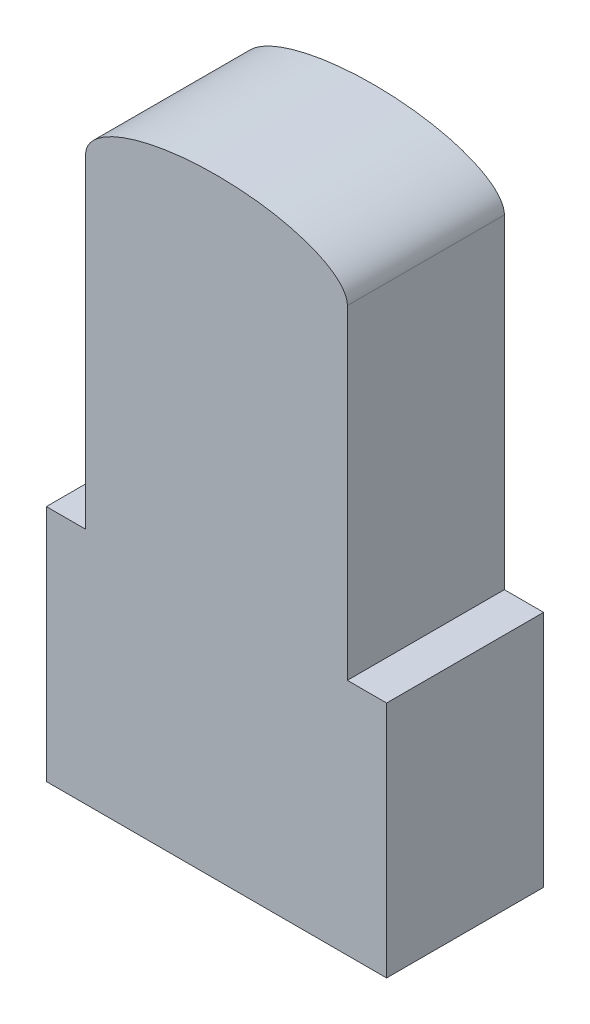
ISO-10303-21;
HEADER;
FILE_DESCRIPTION(('STEP AP214'),'2;1');
FILE_NAME('part.step','',(''),(''),'','','');
FILE_SCHEMA(('AUTOMOTIVE_DESIGN { 1 0 10303 214 1 1 1 1 }'));
ENDSEC;
DATA;
#1=APPLICATION_CONTEXT('core data for automotive mechanical design processes');
#2=APPLICATION_PROTOCOL_DEFINITION('international standard','automotive_design',2000,#1);
#3=PRODUCT_CONTEXT('',#1,'mechanical');
#4=PRODUCT('Part','Part','',(#3));
#5=PRODUCT_RELATED_PRODUCT_CATEGORY('part','',(#4));
#6=PRODUCT_DEFINITION_FORMATION('','',#4);
#7=PRODUCT_DEFINITION_CONTEXT('part definition',#1,'design');
#8=PRODUCT_DEFINITION('design','',#6,#7);
#9=PRODUCT_DEFINITION_SHAPE('','',#8);
#10=(LENGTH_UNIT() NAMED_UNIT(*) SI_UNIT(.MILLI.,.METRE.));
#11=(NAMED_UNIT(*) PLANE_ANGLE_UNIT() SI_UNIT($,.RADIAN.));
#12=(NAMED_UNIT(*) SI_UNIT($,.STERADIAN.) SOLID_ANGLE_UNIT());
#13=UNCERTAINTY_MEASURE_WITH_UNIT(LENGTH_MEASURE(1.E-05),#10,'distance_accuracy_value','');
#14=(GEOMETRIC_REPRESENTATION_CONTEXT(3) GLOBAL_UNCERTAINTY_ASSIGNED_CONTEXT((#13)) GLOBAL_UNIT_ASSIGNED_CONTEXT((#10,
#11,#12)) REPRESENTATION_CONTEXT('',''));
#15=CARTESIAN_POINT('',(0.,0.,0.));
#16=DIRECTION('',(0.,0.,1.));
#17=DIRECTION('',(1.,0.,0.));
#18=AXIS2_PLACEMENT_3D('',#15,#16,#17);
#19=CARTESIAN_POINT('',(13.2973233247,296.5179486247,3.));
#20=DIRECTION('',(0.,0.,1.));
#21=DIRECTION('',(1.,0.,0.));
#22=AXIS2_PLACEMENT_3D('',#19,#20,#21);
#23=ELLIPSE('',#22,2.5,0.909487209000026);
#24=DIRECTION('',(0.,0.,-1.));
#25=VECTOR('',#24,1.);
#26=SURFACE_OF_LINEAR_EXTRUSION('',#23,#25);
#27=CARTESIAN_POINT('',(13.2973233247,296.5179486247,0.));
#28=DIRECTION('',(0.,0.,1.));
#29=DIRECTION('',(1.,0.,0.));
#30=AXIS2_PLACEMENT_3D('',#27,#28,#29);
#31=ELLIPSE('',#30,2.5,0.909487209000026);
#32=CARTESIAN_POINT('',(15.7973233247,296.5179486247,0.));
#33=VERTEX_POINT('',#32);
#34=CARTESIAN_POINT('',(10.7973233247,296.5179486247,0.));
#35=VERTEX_POINT('',#34);
#36=EDGE_CURVE('E130',#33,#35,#31,.T.);
#37=ORIENTED_EDGE('',*,*,#36,.T.);
#38=DIRECTION('',(0.,0.,-1.));
#39=VECTOR('',#38,1.);
#40=CARTESIAN_POINT('',(10.7973233247,296.5179486247,3.));
#41=LINE('',#40,#39);
#42=CARTESIAN_POINT('',(10.7973233247,296.5179486247,3.));
#43=VERTEX_POINT('',#42);
#44=EDGE_CURVE('E11',#43,#35,#41,.T.);
#45=ORIENTED_EDGE('',*,*,#44,.F.);
#46=CARTESIAN_POINT('',(15.7973233247,296.5179486247,3.));
#47=VERTEX_POINT('',#46);
#48=EDGE_CURVE('E144',#47,#43,#23,.T.);
#49=ORIENTED_EDGE('',*,*,#48,.F.);
#50=DIRECTION('',(0.,0.,-1.));
#51=VECTOR('',#50,1.);
#52=CARTESIAN_POINT('',(15.7973233247,296.5179486247,3.));
#53=LINE('',#52,#51);
#54=EDGE_CURVE('E126',#47,#33,#53,.T.);
#55=ORIENTED_EDGE('',*,*,#54,.T.);
#56=EDGE_LOOP('',(#37,#45,#49,#55));
#57=FACE_BOUND('',#56,.T.);
#58=ADVANCED_FACE('F33',(#57),#26,.F.);
#59=CARTESIAN_POINT('',(10.7973233247,296.5179486247,3.));
#60=DIRECTION('',(1.,0.,0.));
#61=DIRECTION('',(0.,1.,0.));
#62=AXIS2_PLACEMENT_3D('',#59,#60,#61);
#63=PLANE('',#62);
#64=DIRECTION('',(0.,-1.,0.));
#65=VECTOR('',#64,1.);
#66=CARTESIAN_POINT('',(10.7973233247,296.5179486247,0.));
#67=LINE('',#66,#65);
#68=CARTESIAN_POINT('',(10.7973233247,290.3179486247,0.));
#69=VERTEX_POINT('',#68);
#70=EDGE_CURVE('E133',#35,#69,#67,.T.);
#71=ORIENTED_EDGE('',*,*,#70,.T.);
#72=DIRECTION('',(0.,0.,-1.));
#73=VECTOR('',#72,1.);
#74=CARTESIAN_POINT('',(10.7973233247,290.3179486247,3.));
#75=LINE('',#74,#73);
#76=CARTESIAN_POINT('',(10.7973233247,290.3179486247,3.));
#77=VERTEX_POINT('',#76);
#78=EDGE_CURVE('E42',#77,#69,#75,.T.);
#79=ORIENTED_EDGE('',*,*,#78,.F.);
#80=DIRECTION('',(0.,-1.,0.));
#81=VECTOR('',#80,1.);
#82=CARTESIAN_POINT('',(10.7973233247,296.5179486247,3.));
#83=LINE('',#82,#81);
#84=EDGE_CURVE('E93',#43,#77,#83,.T.);
#85=ORIENTED_EDGE('',*,*,#84,.F.);
#86=ORIENTED_EDGE('',*,*,#44,.T.);
#87=EDGE_LOOP('',(#71,#79,#85,#86));
#88=FACE_BOUND('',#87,.T.);
#89=ADVANCED_FACE('F179',(#88),#63,.F.);
#90=CARTESIAN_POINT('',(10.7973233247,290.3179486247,3.));
#91=DIRECTION('',(0.,-1.,0.));
#92=DIRECTION('',(0.,0.,-1.));
#93=AXIS2_PLACEMENT_3D('',#90,#91,#92);
#94=PLANE('',#93);
#95=DIRECTION('',(-1.,0.,0.));
#96=VECTOR('',#95,1.);
#97=CARTESIAN_POINT('',(10.7973233247,290.3179486247,0.));
#98=LINE('',#97,#96);
#99=CARTESIAN_POINT('',(10.0473233247,290.3179486247,0.));
#100=VERTEX_POINT('',#99);
#101=EDGE_CURVE('E135',#69,#100,#98,.T.);
#102=ORIENTED_EDGE('',*,*,#101,.T.);
#103=DIRECTION('',(0.,0.,-1.));
#104=VECTOR('',#103,1.);
#105=CARTESIAN_POINT('',(10.0473233247,290.3179486247,3.));
#106=LINE('',#105,#104);
#107=CARTESIAN_POINT('',(10.0473233247,290.3179486247,3.));
#108=VERTEX_POINT('',#107);
#109=EDGE_CURVE('E151',#108,#100,#106,.T.);
#110=ORIENTED_EDGE('',*,*,#109,.F.);
#111=DIRECTION('',(-1.,0.,0.));
#112=VECTOR('',#111,1.);
#113=CARTESIAN_POINT('',(10.7973233247,290.3179486247,3.));
#114=LINE('',#113,#112);
#115=EDGE_CURVE('E159',#77,#108,#114,.T.);
#116=ORIENTED_EDGE('',*,*,#115,.F.);
#117=ORIENTED_EDGE('',*,*,#78,.T.);
#118=EDGE_LOOP('',(#102,#110,#116,#117));
#119=FACE_BOUND('',#118,.T.);
#120=ADVANCED_FACE('F157',(#119),#94,.F.);
#121=CARTESIAN_POINT('',(10.0473233247,290.3179486247,3.));
#122=DIRECTION('',(1.,0.,0.));
#123=DIRECTION('',(0.,0.,-1.));
#124=AXIS2_PLACEMENT_3D('',#121,#122,#123);
#125=PLANE('',#124);
#126=DIRECTION('',(0.,-1.,0.));
#127=VECTOR('',#126,1.);
#128=CARTESIAN_POINT('',(10.0473233247,290.3179486247,0.));
#129=LINE('',#128,#127);
#130=CARTESIAN_POINT('',(10.0473233247,285.7679486247,0.));
#131=VERTEX_POINT('',#130);
#132=EDGE_CURVE('E137',#100,#131,#129,.T.);
#133=ORIENTED_EDGE('',*,*,#132,.T.);
#134=DIRECTION('',(0.,0.,-1.));
#135=VECTOR('',#134,1.);
#136=CARTESIAN_POINT('',(10.0473233247,285.7679486247,3.));
#137=LINE('',#136,#135);
#138=CARTESIAN_POINT('',(10.0473233247,285.7679486247,3.));
#139=VERTEX_POINT('',#138);
#140=EDGE_CURVE('E148',#139,#131,#137,.T.);
#141=ORIENTED_EDGE('',*,*,#140,.F.);
#142=DIRECTION('',(0.,-1.,0.));
#143=VECTOR('',#142,1.);
#144=CARTESIAN_POINT('',(10.0473233247,290.3179486247,3.));
#145=LINE('',#144,#143);
#146=EDGE_CURVE('E171',#108,#139,#145,.T.);
#147=ORIENTED_EDGE('',*,*,#146,.F.);
#148=ORIENTED_EDGE('',*,*,#109,.T.);
#149=EDGE_LOOP('',(#133,#141,#147,#148));
#150=FACE_BOUND('',#149,.T.);
#151=ADVANCED_FACE('F167',(#150),#125,.F.);
#152=CARTESIAN_POINT('',(10.0473233247,285.7679486247,3.));
#153=DIRECTION('',(0.,1.,0.));
#154=DIRECTION('',(0.,0.,1.));
#155=AXIS2_PLACEMENT_3D('',#152,#153,#154);
#156=PLANE('',#155);
#157=DIRECTION('',(1.,0.,0.));
#158=VECTOR('',#157,1.);
#159=CARTESIAN_POINT('',(10.0473233247,285.7679486247,0.));
#160=LINE('',#159,#158);
#161=CARTESIAN_POINT('',(16.5473233247,285.7679486247,0.));
#162=VERTEX_POINT('',#161);
#163=EDGE_CURVE('E139',#131,#162,#160,.T.);
#164=ORIENTED_EDGE('',*,*,#163,.T.);
#165=DIRECTION('',(0.,0.,-1.));
#166=VECTOR('',#165,1.);
#167=CARTESIAN_POINT('',(16.5473233247,285.7679486247,3.));
#168=LINE('',#167,#166);
#169=CARTESIAN_POINT('',(16.5473233247,285.7679486247,3.));
#170=VERTEX_POINT('',#169);
#171=EDGE_CURVE('E121',#170,#162,#168,.T.);
#172=ORIENTED_EDGE('',*,*,#171,.F.);
#173=DIRECTION('',(1.,0.,0.));
#174=VECTOR('',#173,1.);
#175=CARTESIAN_POINT('',(10.0473233247,285.7679486247,3.));
#176=LINE('',#175,#174);
#177=EDGE_CURVE('E112',#139,#170,#176,.T.);
#178=ORIENTED_EDGE('',*,*,#177,.F.);
#179=ORIENTED_EDGE('',*,*,#140,.T.);
#180=EDGE_LOOP('',(#164,#172,#178,#179));
#181=FACE_BOUND('',#180,.T.);
#182=ADVANCED_FACE('F170',(#181),#156,.F.);
#183=CARTESIAN_POINT('',(16.5473233247,285.7679486247,3.));
#184=DIRECTION('',(-1.,0.,0.));
#185=DIRECTION('',(0.,0.,1.));
#186=AXIS2_PLACEMENT_3D('',#183,#184,#185);
#187=PLANE('',#186);
#188=DIRECTION('',(0.,1.,0.));
#189=VECTOR('',#188,1.);
#190=CARTESIAN_POINT('',(16.5473233247,285.7679486247,0.));
#191=LINE('',#190,#189);
#192=CARTESIAN_POINT('',(16.5473233247,290.3179486247,0.));
#193=VERTEX_POINT('',#192);
#194=EDGE_CURVE('E120',#162,#193,#191,.T.);
#195=ORIENTED_EDGE('',*,*,#194,.T.);
#196=DIRECTION('',(0.,0.,-1.));
#197=VECTOR('',#196,1.);
#198=CARTESIAN_POINT('',(16.5473233247,290.3179486247,3.));
#199=LINE('',#198,#197);
#200=CARTESIAN_POINT('',(16.5473233247,290.3179486247,3.));
#201=VERTEX_POINT('',#200);
#202=EDGE_CURVE('E117',#201,#193,#199,.T.);
#203=ORIENTED_EDGE('',*,*,#202,.F.);
#204=DIRECTION('',(0.,1.,0.));
#205=VECTOR('',#204,1.);
#206=CARTESIAN_POINT('',(16.5473233247,285.7679486247,3.));
#207=LINE('',#206,#205);
#208=EDGE_CURVE('E106',#170,#201,#207,.T.);
#209=ORIENTED_EDGE('',*,*,#208,.F.);
#210=ORIENTED_EDGE('',*,*,#171,.T.);
#211=EDGE_LOOP('',(#195,#203,#209,#210));
#212=FACE_BOUND('',#211,.T.);
#213=ADVANCED_FACE('F118',(#212),#187,.F.);
#214=CARTESIAN_POINT('',(16.5473233247,290.3179486247,3.));
#215=DIRECTION('',(0.,-1.,0.));
#216=DIRECTION('',(0.,0.,-1.));
#217=AXIS2_PLACEMENT_3D('',#214,#215,#216);
#218=PLANE('',#217);
#219=DIRECTION('',(-1.,0.,0.));
#220=VECTOR('',#219,1.);
#221=CARTESIAN_POINT('',(16.5473233247,290.3179486247,0.));
#222=LINE('',#221,#220);
#223=CARTESIAN_POINT('',(15.7973233247,290.3179486247,0.));
#224=VERTEX_POINT('',#223);
#225=EDGE_CURVE('E79',#193,#224,#222,.T.);
#226=ORIENTED_EDGE('',*,*,#225,.T.);
#227=DIRECTION('',(0.,0.,-1.));
#228=VECTOR('',#227,1.);
#229=CARTESIAN_POINT('',(15.7973233247,290.3179486247,3.));
#230=LINE('',#229,#228);
#231=CARTESIAN_POINT('',(15.7973233247,290.3179486247,3.));
#232=VERTEX_POINT('',#231);
#233=EDGE_CURVE('E122',#232,#224,#230,.T.);
#234=ORIENTED_EDGE('',*,*,#233,.F.);
#235=DIRECTION('',(-1.,0.,0.));
#236=VECTOR('',#235,1.);
#237=CARTESIAN_POINT('',(16.5473233247,290.3179486247,3.));
#238=LINE('',#237,#236);
#239=EDGE_CURVE('E110',#201,#232,#238,.T.);
#240=ORIENTED_EDGE('',*,*,#239,.F.);
#241=ORIENTED_EDGE('',*,*,#202,.T.);
#242=EDGE_LOOP('',(#226,#234,#240,#241));
#243=FACE_BOUND('',#242,.T.);
#244=ADVANCED_FACE('F124',(#243),#218,.F.);
#245=CARTESIAN_POINT('',(15.7973233247,290.3179486247,3.));
#246=DIRECTION('',(-1.,0.,0.));
#247=DIRECTION('',(0.,0.,1.));
#248=AXIS2_PLACEMENT_3D('',#245,#246,#247);
#249=PLANE('',#248);
#250=DIRECTION('',(0.,1.,0.));
#251=VECTOR('',#250,1.);
#252=CARTESIAN_POINT('',(15.7973233247,290.3179486247,0.));
#253=LINE('',#252,#251);
#254=EDGE_CURVE('E85',#224,#33,#253,.T.);
#255=ORIENTED_EDGE('',*,*,#254,.T.);
#256=ORIENTED_EDGE('',*,*,#54,.F.);
#257=DIRECTION('',(0.,1.,0.));
#258=VECTOR('',#257,1.);
#259=CARTESIAN_POINT('',(15.7973233247,290.3179486247,3.));
#260=LINE('',#259,#258);
#261=EDGE_CURVE('E50',#232,#47,#260,.T.);
#262=ORIENTED_EDGE('',*,*,#261,.F.);
#263=ORIENTED_EDGE('',*,*,#233,.T.);
#264=EDGE_LOOP('',(#255,#256,#262,#263));
#265=FACE_BOUND('',#264,.T.);
#266=ADVANCED_FACE('F195',(#265),#249,.F.);
#267=CARTESIAN_POINT('',(13.2973233247,296.5179486247,3.));
#268=DIRECTION('',(0.,0.,1.));
#269=DIRECTION('',(1.,0.,0.));
#270=AXIS2_PLACEMENT_3D('',#267,#268,#269);
#271=PLANE('',#270);
#272=ORIENTED_EDGE('',*,*,#48,.T.);
#273=ORIENTED_EDGE('',*,*,#84,.T.);
#274=ORIENTED_EDGE('',*,*,#115,.T.);
#275=ORIENTED_EDGE('',*,*,#146,.T.);
#276=ORIENTED_EDGE('',*,*,#177,.T.);
#277=ORIENTED_EDGE('',*,*,#208,.T.);
#278=ORIENTED_EDGE('',*,*,#239,.T.);
#279=ORIENTED_EDGE('',*,*,#261,.T.);
#280=EDGE_LOOP('',(#272,#273,#274,#275,#276,#277,#278,#279));
#281=FACE_BOUND('',#280,.T.);
#282=ADVANCED_FACE('F108',(#281),#271,.T.);
#283=CARTESIAN_POINT('',(13.2973233247,296.5179486247,0.));
#284=DIRECTION('',(0.,0.,1.));
#285=DIRECTION('',(1.,0.,0.));
#286=AXIS2_PLACEMENT_3D('',#283,#284,#285);
#287=PLANE('',#286);
#288=ORIENTED_EDGE('',*,*,#36,.F.);
#289=ORIENTED_EDGE('',*,*,#254,.F.);
#290=ORIENTED_EDGE('',*,*,#225,.F.);
#291=ORIENTED_EDGE('',*,*,#194,.F.);
#292=ORIENTED_EDGE('',*,*,#163,.F.);
#293=ORIENTED_EDGE('',*,*,#132,.F.);
#294=ORIENTED_EDGE('',*,*,#101,.F.);
#295=ORIENTED_EDGE('',*,*,#70,.F.);
#296=EDGE_LOOP('',(#288,#289,#290,#291,#292,#293,#294,#295));
#297=FACE_BOUND('',#296,.T.);
#298=ADVANCED_FACE('F163',(#297),#287,.F.);
#299=CLOSED_SHELL('',(#58,#89,#120,#151,#182,#213,#244,#266,#282,#298));
#300=MANIFOLD_SOLID_BREP('B2',#299);
#301=ADVANCED_BREP_SHAPE_REPRESENTATION('',(#18,#300),#14);
#302=SHAPE_DEFINITION_REPRESENTATION(#9,#301);
ENDSEC;
END-ISO-10303-21;
